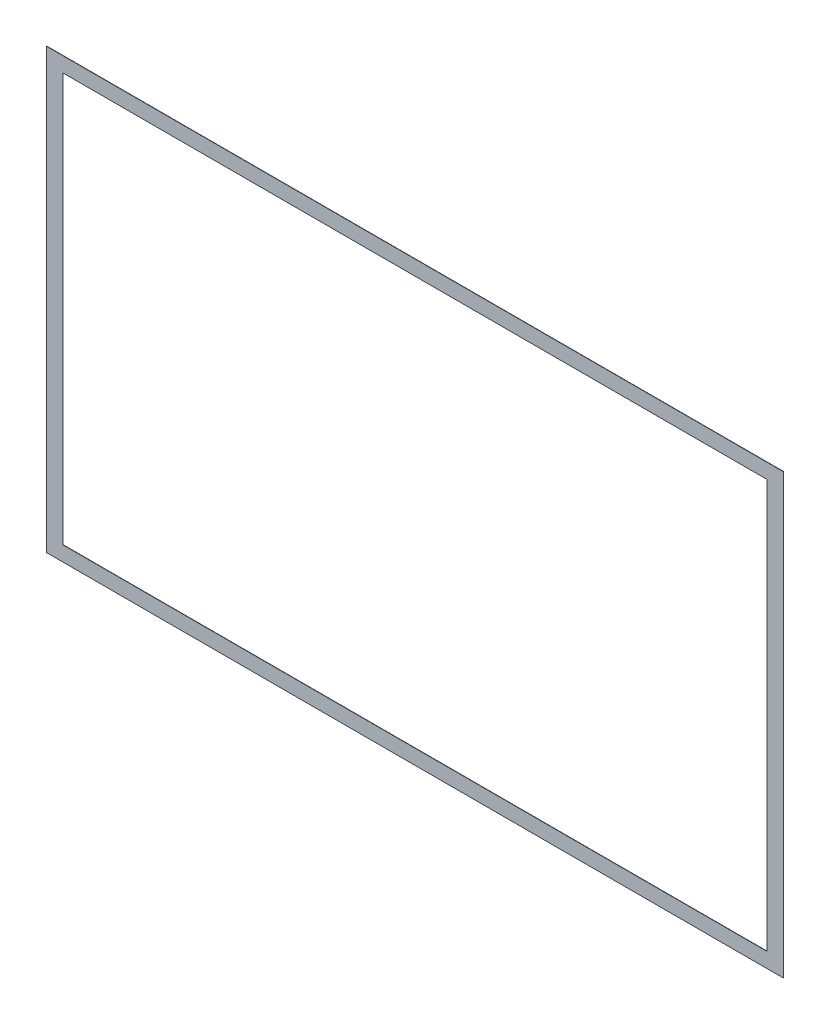
ISO-10303-21;
HEADER;
FILE_DESCRIPTION(('STEP AP214'),'2;1');
FILE_NAME('part.step','',(''),(''),'','','');
FILE_SCHEMA(('AUTOMOTIVE_DESIGN { 1 0 10303 214 1 1 1 1 }'));
ENDSEC;
DATA;
#1=APPLICATION_CONTEXT('core data for automotive mechanical design processes');
#2=APPLICATION_PROTOCOL_DEFINITION('international standard','automotive_design',2000,#1);
#3=PRODUCT_CONTEXT('',#1,'mechanical');
#4=PRODUCT('Part','Part','',(#3));
#5=PRODUCT_RELATED_PRODUCT_CATEGORY('part','',(#4));
#6=PRODUCT_DEFINITION_FORMATION('','',#4);
#7=PRODUCT_DEFINITION_CONTEXT('part definition',#1,'design');
#8=PRODUCT_DEFINITION('design','',#6,#7);
#9=PRODUCT_DEFINITION_SHAPE('','',#8);
#10=(LENGTH_UNIT() NAMED_UNIT(*) SI_UNIT(.MILLI.,.METRE.));
#11=(NAMED_UNIT(*) PLANE_ANGLE_UNIT() SI_UNIT($,.RADIAN.));
#12=(NAMED_UNIT(*) SI_UNIT($,.STERADIAN.) SOLID_ANGLE_UNIT());
#13=UNCERTAINTY_MEASURE_WITH_UNIT(LENGTH_MEASURE(1.E-05),#10,'distance_accuracy_value','');
#14=(GEOMETRIC_REPRESENTATION_CONTEXT(3) GLOBAL_UNCERTAINTY_ASSIGNED_CONTEXT((#13)) GLOBAL_UNIT_ASSIGNED_CONTEXT((#10,
#11,#12)) REPRESENTATION_CONTEXT('',''));
#15=CARTESIAN_POINT('',(0.,0.,0.));
#16=DIRECTION('',(0.,0.,1.));
#17=DIRECTION('',(1.,0.,0.));
#18=AXIS2_PLACEMENT_3D('',#15,#16,#17);
#19=CARTESIAN_POINT('',(-11.8,7.8,0.));
#20=DIRECTION('',(0.,1.,0.));
#21=DIRECTION('',(1.,0.,0.));
#22=AXIS2_PLACEMENT_3D('',#19,#20,#21);
#23=PLANE('',#22);
#24=DIRECTION('',(1.,0.,0.));
#25=VECTOR('',#24,1.);
#26=CARTESIAN_POINT('',(-11.8,7.8,0.));
#27=LINE('',#26,#25);
#28=CARTESIAN_POINT('',(-11.8,7.8,0.));
#29=VERTEX_POINT('',#28);
#30=CARTESIAN_POINT('',(11.8,7.8,0.));
#31=VERTEX_POINT('',#30);
#32=EDGE_CURVE('E136',#29,#31,#27,.T.);
#33=ORIENTED_EDGE('',*,*,#32,.T.);
#34=DIRECTION('',(0.,0.,1.));
#35=VECTOR('',#34,1.);
#36=CARTESIAN_POINT('',(11.8,7.8,0.));
#37=LINE('',#36,#35);
#38=CARTESIAN_POINT('',(11.8,7.8,0.01));
#39=VERTEX_POINT('',#38);
#40=EDGE_CURVE('E11',#31,#39,#37,.T.);
#41=ORIENTED_EDGE('',*,*,#40,.T.);
#42=DIRECTION('',(1.,0.,0.));
#43=VECTOR('',#42,1.);
#44=CARTESIAN_POINT('',(-11.8,7.8,0.01));
#45=LINE('',#44,#43);
#46=CARTESIAN_POINT('',(-11.8,7.8,0.01));
#47=VERTEX_POINT('',#46);
#48=EDGE_CURVE('E148',#47,#39,#45,.T.);
#49=ORIENTED_EDGE('',*,*,#48,.F.);
#50=DIRECTION('',(0.,0.,1.));
#51=VECTOR('',#50,1.);
#52=CARTESIAN_POINT('',(-11.8,7.8,0.));
#53=LINE('',#52,#51);
#54=EDGE_CURVE('E186',#29,#47,#53,.T.);
#55=ORIENTED_EDGE('',*,*,#54,.F.);
#56=EDGE_LOOP('',(#33,#41,#49,#55));
#57=FACE_BOUND('',#56,.T.);
#58=ADVANCED_FACE('F17',(#57),#23,.F.);
#59=CARTESIAN_POINT('',(11.8,7.8,0.));
#60=DIRECTION('',(1.,0.,0.));
#61=DIRECTION('',(0.,1.,0.));
#62=AXIS2_PLACEMENT_3D('',#59,#60,#61);
#63=PLANE('',#62);
#64=DIRECTION('',(0.,-1.,0.));
#65=VECTOR('',#64,1.);
#66=CARTESIAN_POINT('',(11.8,7.8,0.));
#67=LINE('',#66,#65);
#68=CARTESIAN_POINT('',(11.8,-5.9,0.));
#69=VERTEX_POINT('',#68);
#70=EDGE_CURVE('E133',#31,#69,#67,.T.);
#71=ORIENTED_EDGE('',*,*,#70,.T.);
#72=DIRECTION('',(0.,0.,1.));
#73=VECTOR('',#72,1.);
#74=CARTESIAN_POINT('',(11.8,-5.9,0.));
#75=LINE('',#74,#73);
#76=CARTESIAN_POINT('',(11.8,-5.9,0.01));
#77=VERTEX_POINT('',#76);
#78=EDGE_CURVE('E27',#69,#77,#75,.T.);
#79=ORIENTED_EDGE('',*,*,#78,.T.);
#80=DIRECTION('',(0.,-1.,0.));
#81=VECTOR('',#80,1.);
#82=CARTESIAN_POINT('',(11.8,7.8,0.01));
#83=LINE('',#82,#81);
#84=EDGE_CURVE('E178',#39,#77,#83,.T.);
#85=ORIENTED_EDGE('',*,*,#84,.F.);
#86=ORIENTED_EDGE('',*,*,#40,.F.);
#87=EDGE_LOOP('',(#71,#79,#85,#86));
#88=FACE_BOUND('',#87,.T.);
#89=ADVANCED_FACE('F19',(#88),#63,.F.);
#90=CARTESIAN_POINT('',(11.8,-5.9,0.));
#91=DIRECTION('',(0.,-1.,0.));
#92=DIRECTION('',(0.,0.,-1.));
#93=AXIS2_PLACEMENT_3D('',#90,#91,#92);
#94=PLANE('',#93);
#95=DIRECTION('',(-1.,0.,0.));
#96=VECTOR('',#95,1.);
#97=CARTESIAN_POINT('',(11.8,-5.9,0.));
#98=LINE('',#97,#96);
#99=CARTESIAN_POINT('',(-11.8,-5.9,0.));
#100=VERTEX_POINT('',#99);
#101=EDGE_CURVE('E137',#69,#100,#98,.T.);
#102=ORIENTED_EDGE('',*,*,#101,.T.);
#103=DIRECTION('',(0.,0.,1.));
#104=VECTOR('',#103,1.);
#105=CARTESIAN_POINT('',(-11.8,-5.9,0.));
#106=LINE('',#105,#104);
#107=CARTESIAN_POINT('',(-11.8,-5.9,0.01));
#108=VERTEX_POINT('',#107);
#109=EDGE_CURVE('E190',#100,#108,#106,.T.);
#110=ORIENTED_EDGE('',*,*,#109,.T.);
#111=DIRECTION('',(-1.,0.,0.));
#112=VECTOR('',#111,1.);
#113=CARTESIAN_POINT('',(11.8,-5.9,0.01));
#114=LINE('',#113,#112);
#115=EDGE_CURVE('E182',#77,#108,#114,.T.);
#116=ORIENTED_EDGE('',*,*,#115,.F.);
#117=ORIENTED_EDGE('',*,*,#78,.F.);
#118=EDGE_LOOP('',(#102,#110,#116,#117));
#119=FACE_BOUND('',#118,.T.);
#120=ADVANCED_FACE('F336',(#119),#94,.F.);
#121=CARTESIAN_POINT('',(-11.8,-5.9,0.));
#122=DIRECTION('',(-1.,0.,0.));
#123=DIRECTION('',(0.,0.,1.));
#124=AXIS2_PLACEMENT_3D('',#121,#122,#123);
#125=PLANE('',#124);
#126=DIRECTION('',(0.,1.,0.));
#127=VECTOR('',#126,1.);
#128=CARTESIAN_POINT('',(-11.8,-5.9,0.));
#129=LINE('',#128,#127);
#130=EDGE_CURVE('E165',#100,#29,#129,.T.);
#131=ORIENTED_EDGE('',*,*,#130,.T.);
#132=ORIENTED_EDGE('',*,*,#54,.T.);
#133=DIRECTION('',(0.,1.,0.));
#134=VECTOR('',#133,1.);
#135=CARTESIAN_POINT('',(-11.8,-5.9,0.01));
#136=LINE('',#135,#134);
#137=EDGE_CURVE('E144',#108,#47,#136,.T.);
#138=ORIENTED_EDGE('',*,*,#137,.F.);
#139=ORIENTED_EDGE('',*,*,#109,.F.);
#140=EDGE_LOOP('',(#131,#132,#138,#139));
#141=FACE_BOUND('',#140,.T.);
#142=ADVANCED_FACE('F326',(#141),#125,.F.);
#143=CARTESIAN_POINT('',(12.35,-6.4,0.));
#144=DIRECTION('',(0.,-1.,0.));
#145=DIRECTION('',(0.,0.,-1.));
#146=AXIS2_PLACEMENT_3D('',#143,#144,#145);
#147=PLANE('',#146);
#148=DIRECTION('',(0.,0.,1.));
#149=VECTOR('',#148,1.);
#150=CARTESIAN_POINT('',(12.35,-6.4,0.));
#151=LINE('',#150,#149);
#152=CARTESIAN_POINT('',(12.35,-6.4,0.));
#153=VERTEX_POINT('',#152);
#154=CARTESIAN_POINT('',(12.35,-6.4,0.01));
#155=VERTEX_POINT('',#154);
#156=EDGE_CURVE('E152',#153,#155,#151,.T.);
#157=ORIENTED_EDGE('',*,*,#156,.T.);
#158=DIRECTION('',(-1.,0.,0.));
#159=VECTOR('',#158,1.);
#160=CARTESIAN_POINT('',(12.35,-6.4,0.01));
#161=LINE('',#160,#159);
#162=CARTESIAN_POINT('',(-12.35,-6.4,0.01));
#163=VERTEX_POINT('',#162);
#164=EDGE_CURVE('E149',#155,#163,#161,.T.);
#165=ORIENTED_EDGE('',*,*,#164,.T.);
#166=DIRECTION('',(0.,0.,1.));
#167=VECTOR('',#166,1.);
#168=CARTESIAN_POINT('',(-12.35,-6.4,0.));
#169=LINE('',#168,#167);
#170=CARTESIAN_POINT('',(-12.35,-6.4,0.));
#171=VERTEX_POINT('',#170);
#172=EDGE_CURVE('E105',#171,#163,#169,.T.);
#173=ORIENTED_EDGE('',*,*,#172,.F.);
#174=DIRECTION('',(-1.,0.,0.));
#175=VECTOR('',#174,1.);
#176=CARTESIAN_POINT('',(12.35,-6.4,0.));
#177=LINE('',#176,#175);
#178=EDGE_CURVE('E143',#153,#171,#177,.T.);
#179=ORIENTED_EDGE('',*,*,#178,.F.);
#180=EDGE_LOOP('',(#157,#165,#173,#179));
#181=FACE_BOUND('',#180,.T.);
#182=ADVANCED_FACE('F315',(#181),#147,.T.);
#183=CARTESIAN_POINT('',(0.,0.95,0.01));
#184=DIRECTION('',(0.,0.,1.));
#185=DIRECTION('',(1.,0.,0.));
#186=AXIS2_PLACEMENT_3D('',#183,#184,#185);
#187=PLANE('',#186);
#188=ORIENTED_EDGE('',*,*,#137,.T.);
#189=ORIENTED_EDGE('',*,*,#48,.T.);
#190=ORIENTED_EDGE('',*,*,#84,.T.);
#191=ORIENTED_EDGE('',*,*,#115,.T.);
#192=EDGE_LOOP('',(#188,#189,#190,#191));
#193=FACE_BOUND('',#192,.T.);
#194=DIRECTION('',(1.,0.,0.));
#195=VECTOR('',#194,1.);
#196=CARTESIAN_POINT('',(-12.35,8.3,0.01));
#197=LINE('',#196,#195);
#198=CARTESIAN_POINT('',(-12.35,8.3,0.01));
#199=VERTEX_POINT('',#198);
#200=CARTESIAN_POINT('',(12.35,8.3,0.01));
#201=VERTEX_POINT('',#200);
#202=EDGE_CURVE('E111',#199,#201,#197,.T.);
#203=ORIENTED_EDGE('',*,*,#202,.F.);
#204=DIRECTION('',(0.,1.,0.));
#205=VECTOR('',#204,1.);
#206=CARTESIAN_POINT('',(-12.35,-6.4,0.01));
#207=LINE('',#206,#205);
#208=EDGE_CURVE('E98',#163,#199,#207,.T.);
#209=ORIENTED_EDGE('',*,*,#208,.F.);
#210=ORIENTED_EDGE('',*,*,#164,.F.);
#211=DIRECTION('',(0.,-1.,0.));
#212=VECTOR('',#211,1.);
#213=CARTESIAN_POINT('',(12.35,8.3,0.01));
#214=LINE('',#213,#212);
#215=EDGE_CURVE('E114',#201,#155,#214,.T.);
#216=ORIENTED_EDGE('',*,*,#215,.F.);
#217=EDGE_LOOP('',(#203,#209,#210,#216));
#218=FACE_BOUND('',#217,.T.);
#219=ADVANCED_FACE('F112',(#193,#218),#187,.T.);
#220=CARTESIAN_POINT('',(0.,0.95,0.));
#221=DIRECTION('',(0.,0.,1.));
#222=DIRECTION('',(1.,0.,0.));
#223=AXIS2_PLACEMENT_3D('',#220,#221,#222);
#224=PLANE('',#223);
#225=ORIENTED_EDGE('',*,*,#101,.F.);
#226=ORIENTED_EDGE('',*,*,#70,.F.);
#227=ORIENTED_EDGE('',*,*,#32,.F.);
#228=ORIENTED_EDGE('',*,*,#130,.F.);
#229=EDGE_LOOP('',(#225,#226,#227,#228));
#230=FACE_BOUND('',#229,.T.);
#231=DIRECTION('',(0.,-1.,0.));
#232=VECTOR('',#231,1.);
#233=CARTESIAN_POINT('',(12.35,8.3,0.));
#234=LINE('',#233,#232);
#235=CARTESIAN_POINT('',(12.35,8.3,0.));
#236=VERTEX_POINT('',#235);
#237=EDGE_CURVE('E156',#236,#153,#234,.T.);
#238=ORIENTED_EDGE('',*,*,#237,.T.);
#239=ORIENTED_EDGE('',*,*,#178,.T.);
#240=DIRECTION('',(0.,1.,0.));
#241=VECTOR('',#240,1.);
#242=CARTESIAN_POINT('',(-12.35,-6.4,0.));
#243=LINE('',#242,#241);
#244=CARTESIAN_POINT('',(-12.35,8.3,0.));
#245=VERTEX_POINT('',#244);
#246=EDGE_CURVE('E108',#171,#245,#243,.T.);
#247=ORIENTED_EDGE('',*,*,#246,.T.);
#248=DIRECTION('',(1.,0.,0.));
#249=VECTOR('',#248,1.);
#250=CARTESIAN_POINT('',(-12.35,8.3,0.));
#251=LINE('',#250,#249);
#252=EDGE_CURVE('E124',#245,#236,#251,.T.);
#253=ORIENTED_EDGE('',*,*,#252,.T.);
#254=EDGE_LOOP('',(#238,#239,#247,#253));
#255=FACE_BOUND('',#254,.T.);
#256=ADVANCED_FACE('F293',(#230,#255),#224,.F.);
#257=CARTESIAN_POINT('',(12.35,8.3,0.));
#258=DIRECTION('',(1.,0.,0.));
#259=DIRECTION('',(0.,1.,0.));
#260=AXIS2_PLACEMENT_3D('',#257,#258,#259);
#261=PLANE('',#260);
#262=DIRECTION('',(0.,0.,1.));
#263=VECTOR('',#262,1.);
#264=CARTESIAN_POINT('',(12.35,8.3,0.));
#265=LINE('',#264,#263);
#266=EDGE_CURVE('E119',#236,#201,#265,.T.);
#267=ORIENTED_EDGE('',*,*,#266,.T.);
#268=ORIENTED_EDGE('',*,*,#215,.T.);
#269=ORIENTED_EDGE('',*,*,#156,.F.);
#270=ORIENTED_EDGE('',*,*,#237,.F.);
#271=EDGE_LOOP('',(#267,#268,#269,#270));
#272=FACE_BOUND('',#271,.T.);
#273=ADVANCED_FACE('F283',(#272),#261,.T.);
#274=CARTESIAN_POINT('',(-12.35,-6.4,0.));
#275=DIRECTION('',(-1.,0.,0.));
#276=DIRECTION('',(0.,0.,1.));
#277=AXIS2_PLACEMENT_3D('',#274,#275,#276);
#278=PLANE('',#277);
#279=ORIENTED_EDGE('',*,*,#172,.T.);
#280=ORIENTED_EDGE('',*,*,#208,.T.);
#281=DIRECTION('',(0.,0.,1.));
#282=VECTOR('',#281,1.);
#283=CARTESIAN_POINT('',(-12.35,8.3,0.));
#284=LINE('',#283,#282);
#285=EDGE_CURVE('E103',#245,#199,#284,.T.);
#286=ORIENTED_EDGE('',*,*,#285,.F.);
#287=ORIENTED_EDGE('',*,*,#246,.F.);
#288=EDGE_LOOP('',(#279,#280,#286,#287));
#289=FACE_BOUND('',#288,.T.);
#290=ADVANCED_FACE('F100',(#289),#278,.T.);
#291=CARTESIAN_POINT('',(-12.35,8.3,0.));
#292=DIRECTION('',(0.,1.,0.));
#293=DIRECTION('',(1.,0.,0.));
#294=AXIS2_PLACEMENT_3D('',#291,#292,#293);
#295=PLANE('',#294);
#296=ORIENTED_EDGE('',*,*,#285,.T.);
#297=ORIENTED_EDGE('',*,*,#202,.T.);
#298=ORIENTED_EDGE('',*,*,#266,.F.);
#299=ORIENTED_EDGE('',*,*,#252,.F.);
#300=EDGE_LOOP('',(#296,#297,#298,#299));
#301=FACE_BOUND('',#300,.T.);
#302=ADVANCED_FACE('F122',(#301),#295,.T.);
#303=CLOSED_SHELL('',(#58,#89,#120,#142,#182,#219,#256,#273,#290,#302));
#304=MANIFOLD_SOLID_BREP('B1',#303);
#305=ADVANCED_BREP_SHAPE_REPRESENTATION('',(#18,#304),#14);
#306=SHAPE_DEFINITION_REPRESENTATION(#9,#305);
ENDSEC;
END-ISO-10303-21;
